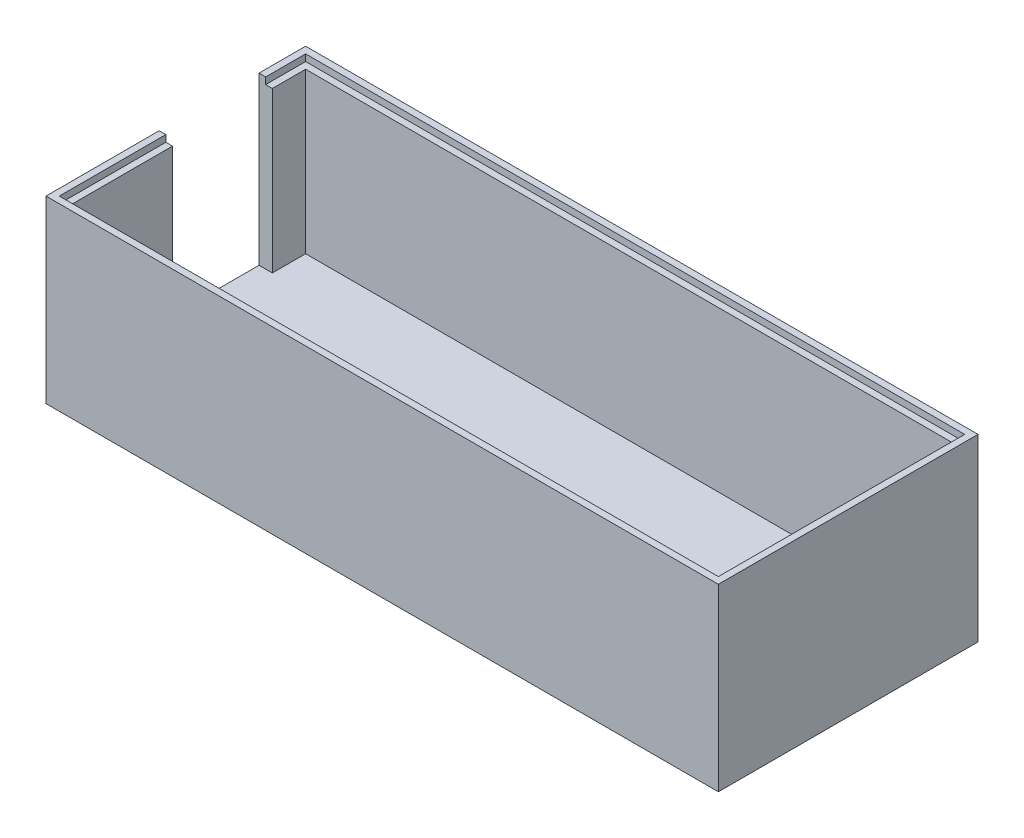
ISO-10303-21;
HEADER;
FILE_DESCRIPTION(('STEP AP214'),'2;1');
FILE_NAME('part.step','',(''),(''),'','','');
FILE_SCHEMA(('AUTOMOTIVE_DESIGN { 1 0 10303 214 1 1 1 1 }'));
ENDSEC;
DATA;
#1=APPLICATION_CONTEXT('core data for automotive mechanical design processes');
#2=APPLICATION_PROTOCOL_DEFINITION('international standard','automotive_design',2000,#1);
#3=PRODUCT_CONTEXT('',#1,'mechanical');
#4=PRODUCT('Part','Part','',(#3));
#5=PRODUCT_RELATED_PRODUCT_CATEGORY('part','',(#4));
#6=PRODUCT_DEFINITION_FORMATION('','',#4);
#7=PRODUCT_DEFINITION_CONTEXT('part definition',#1,'design');
#8=PRODUCT_DEFINITION('design','',#6,#7);
#9=PRODUCT_DEFINITION_SHAPE('','',#8);
#10=(LENGTH_UNIT() NAMED_UNIT(*) SI_UNIT(.MILLI.,.METRE.));
#11=(NAMED_UNIT(*) PLANE_ANGLE_UNIT() SI_UNIT($,.RADIAN.));
#12=(NAMED_UNIT(*) SI_UNIT($,.STERADIAN.) SOLID_ANGLE_UNIT());
#13=UNCERTAINTY_MEASURE_WITH_UNIT(LENGTH_MEASURE(1.E-05),#10,'distance_accuracy_value','');
#14=(GEOMETRIC_REPRESENTATION_CONTEXT(3) GLOBAL_UNCERTAINTY_ASSIGNED_CONTEXT((#13)) GLOBAL_UNIT_ASSIGNED_CONTEXT((#10,
#11,#12)) REPRESENTATION_CONTEXT('',''));
#15=CARTESIAN_POINT('',(0.,0.,0.));
#16=DIRECTION('',(0.,0.,1.));
#17=DIRECTION('',(1.,0.,0.));
#18=AXIS2_PLACEMENT_3D('',#15,#16,#17);
#19=CARTESIAN_POINT('',(0.,25.,0.));
#20=DIRECTION('',(0.,0.,-1.));
#21=DIRECTION('',(-1.,0.,0.));
#22=AXIS2_PLACEMENT_3D('',#19,#20,#21);
#23=PLANE('',#22);
#24=DIRECTION('',(0.,-1.,0.));
#25=VECTOR('',#24,1.);
#26=CARTESIAN_POINT('',(0.,25.,0.));
#27=LINE('',#26,#25);
#28=CARTESIAN_POINT('',(0.,25.,0.));
#29=VERTEX_POINT('',#28);
#30=CARTESIAN_POINT('',(0.,-2.,0.));
#31=VERTEX_POINT('',#30);
#32=EDGE_CURVE('E11',#29,#31,#27,.T.);
#33=ORIENTED_EDGE('',*,*,#32,.T.);
#34=DIRECTION('',(-1.,0.,0.));
#35=VECTOR('',#34,1.);
#36=CARTESIAN_POINT('',(0.,-2.,0.));
#37=LINE('',#36,#35);
#38=CARTESIAN_POINT('',(101.,-2.,0.));
#39=VERTEX_POINT('',#38);
#40=EDGE_CURVE('E155',#39,#31,#37,.T.);
#41=ORIENTED_EDGE('',*,*,#40,.F.);
#42=DIRECTION('',(0.,-1.,0.));
#43=VECTOR('',#42,1.);
#44=CARTESIAN_POINT('',(101.,25.,0.));
#45=LINE('',#44,#43);
#46=CARTESIAN_POINT('',(101.,25.,0.));
#47=VERTEX_POINT('',#46);
#48=EDGE_CURVE('E53',#47,#39,#45,.T.);
#49=ORIENTED_EDGE('',*,*,#48,.F.);
#50=DIRECTION('',(1.,0.,0.));
#51=VECTOR('',#50,1.);
#52=CARTESIAN_POINT('',(0.,25.,0.));
#53=LINE('',#52,#51);
#54=EDGE_CURVE('E234',#29,#47,#53,.T.);
#55=ORIENTED_EDGE('',*,*,#54,.F.);
#56=EDGE_LOOP('',(#33,#41,#49,#55));
#57=FACE_BOUND('',#56,.T.);
#58=ADVANCED_FACE('F45',(#57),#23,.F.);
#59=CARTESIAN_POINT('',(101.,25.,0.));
#60=DIRECTION('',(-1.,0.,0.));
#61=DIRECTION('',(0.,0.,1.));
#62=AXIS2_PLACEMENT_3D('',#59,#60,#61);
#63=PLANE('',#62);
#64=ORIENTED_EDGE('',*,*,#48,.T.);
#65=DIRECTION('',(0.,0.,1.));
#66=VECTOR('',#65,1.);
#67=CARTESIAN_POINT('',(101.,-2.,0.));
#68=LINE('',#67,#66);
#69=CARTESIAN_POINT('',(101.,-2.,-39.));
#70=VERTEX_POINT('',#69);
#71=EDGE_CURVE('E212',#70,#39,#68,.T.);
#72=ORIENTED_EDGE('',*,*,#71,.F.);
#73=DIRECTION('',(0.,-1.,0.));
#74=VECTOR('',#73,1.);
#75=CARTESIAN_POINT('',(101.,25.,-39.));
#76=LINE('',#75,#74);
#77=CARTESIAN_POINT('',(101.,25.,-39.));
#78=VERTEX_POINT('',#77);
#79=EDGE_CURVE('E133',#78,#70,#76,.T.);
#80=ORIENTED_EDGE('',*,*,#79,.F.);
#81=DIRECTION('',(0.,0.,-1.));
#82=VECTOR('',#81,1.);
#83=CARTESIAN_POINT('',(101.,25.,0.));
#84=LINE('',#83,#82);
#85=EDGE_CURVE('E116',#47,#78,#84,.T.);
#86=ORIENTED_EDGE('',*,*,#85,.F.);
#87=EDGE_LOOP('',(#64,#72,#80,#86));
#88=FACE_BOUND('',#87,.T.);
#89=ADVANCED_FACE('F210',(#88),#63,.F.);
#90=CARTESIAN_POINT('',(0.,25.,-39.));
#91=DIRECTION('',(0.,0.,1.));
#92=DIRECTION('',(1.,0.,0.));
#93=AXIS2_PLACEMENT_3D('',#90,#91,#92);
#94=PLANE('',#93);
#95=ORIENTED_EDGE('',*,*,#79,.T.);
#96=DIRECTION('',(1.,0.,0.));
#97=VECTOR('',#96,1.);
#98=CARTESIAN_POINT('',(0.,-2.,-39.));
#99=LINE('',#98,#97);
#100=CARTESIAN_POINT('',(0.,-2.,-39.));
#101=VERTEX_POINT('',#100);
#102=EDGE_CURVE('E128',#101,#70,#99,.T.);
#103=ORIENTED_EDGE('',*,*,#102,.F.);
#104=DIRECTION('',(0.,-1.,0.));
#105=VECTOR('',#104,1.);
#106=CARTESIAN_POINT('',(0.,25.,-39.));
#107=LINE('',#106,#105);
#108=CARTESIAN_POINT('',(0.,25.,-39.));
#109=VERTEX_POINT('',#108);
#110=EDGE_CURVE('E124',#109,#101,#107,.T.);
#111=ORIENTED_EDGE('',*,*,#110,.F.);
#112=DIRECTION('',(-1.,0.,0.));
#113=VECTOR('',#112,1.);
#114=CARTESIAN_POINT('',(0.,25.,-39.));
#115=LINE('',#114,#113);
#116=EDGE_CURVE('E107',#78,#109,#115,.T.);
#117=ORIENTED_EDGE('',*,*,#116,.F.);
#118=EDGE_LOOP('',(#95,#103,#111,#117));
#119=FACE_BOUND('',#118,.T.);
#120=ADVANCED_FACE('F125',(#119),#94,.F.);
#121=CARTESIAN_POINT('',(0.,25.,-39.));
#122=DIRECTION('',(1.,0.,0.));
#123=DIRECTION('',(0.,0.,-1.));
#124=AXIS2_PLACEMENT_3D('',#121,#122,#123);
#125=PLANE('',#124);
#126=ORIENTED_EDGE('',*,*,#110,.T.);
#127=DIRECTION('',(0.,0.,-1.));
#128=VECTOR('',#127,1.);
#129=CARTESIAN_POINT('',(0.,-2.,0.));
#130=LINE('',#129,#128);
#131=EDGE_CURVE('E230',#31,#101,#130,.T.);
#132=ORIENTED_EDGE('',*,*,#131,.F.);
#133=ORIENTED_EDGE('',*,*,#32,.F.);
#134=DIRECTION('',(0.,0.,1.));
#135=VECTOR('',#134,1.);
#136=CARTESIAN_POINT('',(0.,25.,-17.));
#137=LINE('',#136,#135);
#138=CARTESIAN_POINT('',(0.,25.,-17.));
#139=VERTEX_POINT('',#138);
#140=EDGE_CURVE('E177',#139,#29,#137,.T.);
#141=ORIENTED_EDGE('',*,*,#140,.F.);
#142=DIRECTION('',(0.,-1.,0.));
#143=VECTOR('',#142,1.);
#144=CARTESIAN_POINT('',(0.,25.,-17.));
#145=LINE('',#144,#143);
#146=CARTESIAN_POINT('',(0.,0.,-17.));
#147=VERTEX_POINT('',#146);
#148=EDGE_CURVE('E149',#139,#147,#145,.T.);
#149=ORIENTED_EDGE('',*,*,#148,.T.);
#150=DIRECTION('',(0.,0.,-1.));
#151=VECTOR('',#150,1.);
#152=CARTESIAN_POINT('',(0.,0.,0.));
#153=LINE('',#152,#151);
#154=CARTESIAN_POINT('',(0.,0.,-32.));
#155=VERTEX_POINT('',#154);
#156=EDGE_CURVE('E227',#147,#155,#153,.T.);
#157=ORIENTED_EDGE('',*,*,#156,.T.);
#158=DIRECTION('',(0.,-1.,0.));
#159=VECTOR('',#158,1.);
#160=CARTESIAN_POINT('',(0.,25.,-32.));
#161=LINE('',#160,#159);
#162=CARTESIAN_POINT('',(0.,25.,-32.));
#163=VERTEX_POINT('',#162);
#164=EDGE_CURVE('E134',#163,#155,#161,.T.);
#165=ORIENTED_EDGE('',*,*,#164,.F.);
#166=DIRECTION('',(0.,0.,1.));
#167=VECTOR('',#166,1.);
#168=CARTESIAN_POINT('',(0.,25.,-39.));
#169=LINE('',#168,#167);
#170=EDGE_CURVE('E113',#109,#163,#169,.T.);
#171=ORIENTED_EDGE('',*,*,#170,.F.);
#172=EDGE_LOOP('',(#126,#132,#133,#141,#149,#157,#165,#171));
#173=FACE_BOUND('',#172,.T.);
#174=ADVANCED_FACE('F136',(#173),#125,.F.);
#175=CARTESIAN_POINT('',(0.,25.,-32.));
#176=DIRECTION('',(0.,0.,-1.));
#177=DIRECTION('',(-1.,0.,0.));
#178=AXIS2_PLACEMENT_3D('',#175,#176,#177);
#179=PLANE('',#178);
#180=DIRECTION('',(1.,0.,0.));
#181=VECTOR('',#180,1.);
#182=CARTESIAN_POINT('',(2.,24.,-32.));
#183=LINE('',#182,#181);
#184=CARTESIAN_POINT('',(1.,24.,-32.));
#185=VERTEX_POINT('',#184);
#186=CARTESIAN_POINT('',(2.,24.,-32.));
#187=VERTEX_POINT('',#186);
#188=EDGE_CURVE('E247',#185,#187,#183,.T.);
#189=ORIENTED_EDGE('',*,*,#188,.F.);
#190=DIRECTION('',(0.,1.,0.));
#191=VECTOR('',#190,1.);
#192=CARTESIAN_POINT('',(1.,24.,-32.));
#193=LINE('',#192,#191);
#194=CARTESIAN_POINT('',(1.,25.,-32.));
#195=VERTEX_POINT('',#194);
#196=EDGE_CURVE('E231',#185,#195,#193,.T.);
#197=ORIENTED_EDGE('',*,*,#196,.T.);
#198=DIRECTION('',(1.,0.,0.));
#199=VECTOR('',#198,1.);
#200=CARTESIAN_POINT('',(0.,25.,-32.));
#201=LINE('',#200,#199);
#202=EDGE_CURVE('E141',#163,#195,#201,.T.);
#203=ORIENTED_EDGE('',*,*,#202,.F.);
#204=ORIENTED_EDGE('',*,*,#164,.T.);
#205=DIRECTION('',(1.,0.,0.));
#206=VECTOR('',#205,1.);
#207=CARTESIAN_POINT('',(0.,0.,-32.));
#208=LINE('',#207,#206);
#209=CARTESIAN_POINT('',(2.,0.,-32.));
#210=VERTEX_POINT('',#209);
#211=EDGE_CURVE('E150',#155,#210,#208,.T.);
#212=ORIENTED_EDGE('',*,*,#211,.T.);
#213=DIRECTION('',(0.,-1.,0.));
#214=VECTOR('',#213,1.);
#215=CARTESIAN_POINT('',(2.,25.,-32.));
#216=LINE('',#215,#214);
#217=EDGE_CURVE('E82',#187,#210,#216,.T.);
#218=ORIENTED_EDGE('',*,*,#217,.F.);
#219=EDGE_LOOP('',(#189,#197,#203,#204,#212,#218));
#220=FACE_BOUND('',#219,.T.);
#221=ADVANCED_FACE('F357',(#220),#179,.F.);
#222=CARTESIAN_POINT('',(2.,25.,-32.));
#223=DIRECTION('',(-1.,0.,0.));
#224=DIRECTION('',(0.,0.,1.));
#225=AXIS2_PLACEMENT_3D('',#222,#223,#224);
#226=PLANE('',#225);
#227=DIRECTION('',(0.,-1.,0.));
#228=VECTOR('',#227,1.);
#229=CARTESIAN_POINT('',(2.,25.,-37.));
#230=LINE('',#229,#228);
#231=CARTESIAN_POINT('',(2.,24.,-37.));
#232=VERTEX_POINT('',#231);
#233=CARTESIAN_POINT('',(2.,0.,-37.));
#234=VERTEX_POINT('',#233);
#235=EDGE_CURVE('E194',#232,#234,#230,.T.);
#236=ORIENTED_EDGE('',*,*,#235,.F.);
#237=DIRECTION('',(0.,0.,-1.));
#238=VECTOR('',#237,1.);
#239=CARTESIAN_POINT('',(2.,24.,-37.));
#240=LINE('',#239,#238);
#241=EDGE_CURVE('E270',#187,#232,#240,.T.);
#242=ORIENTED_EDGE('',*,*,#241,.F.);
#243=ORIENTED_EDGE('',*,*,#217,.T.);
#244=DIRECTION('',(0.,0.,-1.));
#245=VECTOR('',#244,1.);
#246=CARTESIAN_POINT('',(2.,0.,-32.));
#247=LINE('',#246,#245);
#248=EDGE_CURVE('E154',#210,#234,#247,.T.);
#249=ORIENTED_EDGE('',*,*,#248,.T.);
#250=EDGE_LOOP('',(#236,#242,#243,#249));
#251=FACE_BOUND('',#250,.T.);
#252=ADVANCED_FACE('F347',(#251),#226,.F.);
#253=CARTESIAN_POINT('',(2.,25.,-37.));
#254=DIRECTION('',(0.,0.,-1.));
#255=DIRECTION('',(-1.,0.,0.));
#256=AXIS2_PLACEMENT_3D('',#253,#254,#255);
#257=PLANE('',#256);
#258=DIRECTION('',(0.,-1.,0.));
#259=VECTOR('',#258,1.);
#260=CARTESIAN_POINT('',(99.,25.,-37.));
#261=LINE('',#260,#259);
#262=CARTESIAN_POINT('',(99.,24.,-37.));
#263=VERTEX_POINT('',#262);
#264=CARTESIAN_POINT('',(99.,0.,-37.));
#265=VERTEX_POINT('',#264);
#266=EDGE_CURVE('E190',#263,#265,#261,.T.);
#267=ORIENTED_EDGE('',*,*,#266,.F.);
#268=DIRECTION('',(1.,0.,0.));
#269=VECTOR('',#268,1.);
#270=CARTESIAN_POINT('',(99.,24.,-37.));
#271=LINE('',#270,#269);
#272=EDGE_CURVE('E325',#232,#263,#271,.T.);
#273=ORIENTED_EDGE('',*,*,#272,.F.);
#274=ORIENTED_EDGE('',*,*,#235,.T.);
#275=DIRECTION('',(1.,0.,0.));
#276=VECTOR('',#275,1.);
#277=CARTESIAN_POINT('',(2.,0.,-37.));
#278=LINE('',#277,#276);
#279=EDGE_CURVE('E158',#234,#265,#278,.T.);
#280=ORIENTED_EDGE('',*,*,#279,.T.);
#281=EDGE_LOOP('',(#267,#273,#274,#280));
#282=FACE_BOUND('',#281,.T.);
#283=ADVANCED_FACE('F344',(#282),#257,.F.);
#284=CARTESIAN_POINT('',(99.,25.,-37.));
#285=DIRECTION('',(1.,0.,0.));
#286=DIRECTION('',(0.,0.,-1.));
#287=AXIS2_PLACEMENT_3D('',#284,#285,#286);
#288=PLANE('',#287);
#289=DIRECTION('',(0.,-1.,0.));
#290=VECTOR('',#289,1.);
#291=CARTESIAN_POINT('',(99.,25.,-1.99999999999999));
#292=LINE('',#291,#290);
#293=CARTESIAN_POINT('',(99.,24.,-1.99999999999999));
#294=VERTEX_POINT('',#293);
#295=CARTESIAN_POINT('',(99.,0.,-1.99999999999999));
#296=VERTEX_POINT('',#295);
#297=EDGE_CURVE('E186',#294,#296,#292,.T.);
#298=ORIENTED_EDGE('',*,*,#297,.F.);
#299=DIRECTION('',(0.,0.,1.));
#300=VECTOR('',#299,1.);
#301=CARTESIAN_POINT('',(99.,24.,-1.99999999999999));
#302=LINE('',#301,#300);
#303=EDGE_CURVE('E321',#263,#294,#302,.T.);
#304=ORIENTED_EDGE('',*,*,#303,.F.);
#305=ORIENTED_EDGE('',*,*,#266,.T.);
#306=DIRECTION('',(0.,0.,1.));
#307=VECTOR('',#306,1.);
#308=CARTESIAN_POINT('',(99.,0.,-37.));
#309=LINE('',#308,#307);
#310=EDGE_CURVE('E162',#265,#296,#309,.T.);
#311=ORIENTED_EDGE('',*,*,#310,.T.);
#312=EDGE_LOOP('',(#298,#304,#305,#311));
#313=FACE_BOUND('',#312,.T.);
#314=ADVANCED_FACE('F370',(#313),#288,.F.);
#315=CARTESIAN_POINT('',(99.,25.,-1.99999999999999));
#316=DIRECTION('',(0.,0.,1.));
#317=DIRECTION('',(1.,0.,0.));
#318=AXIS2_PLACEMENT_3D('',#315,#316,#317);
#319=PLANE('',#318);
#320=DIRECTION('',(0.,-1.,0.));
#321=VECTOR('',#320,1.);
#322=CARTESIAN_POINT('',(2.,25.,-1.99999999999999));
#323=LINE('',#322,#321);
#324=CARTESIAN_POINT('',(2.,24.,-1.99999999999999));
#325=VERTEX_POINT('',#324);
#326=CARTESIAN_POINT('',(2.,0.,-1.99999999999999));
#327=VERTEX_POINT('',#326);
#328=EDGE_CURVE('E183',#325,#327,#323,.T.);
#329=ORIENTED_EDGE('',*,*,#328,.F.);
#330=DIRECTION('',(-1.,0.,0.));
#331=VECTOR('',#330,1.);
#332=CARTESIAN_POINT('',(2.,24.,-1.99999999999999));
#333=LINE('',#332,#331);
#334=EDGE_CURVE('E317',#294,#325,#333,.T.);
#335=ORIENTED_EDGE('',*,*,#334,.F.);
#336=ORIENTED_EDGE('',*,*,#297,.T.);
#337=DIRECTION('',(-1.,0.,0.));
#338=VECTOR('',#337,1.);
#339=CARTESIAN_POINT('',(99.,0.,-1.99999999999999));
#340=LINE('',#339,#338);
#341=EDGE_CURVE('E166',#296,#327,#340,.T.);
#342=ORIENTED_EDGE('',*,*,#341,.T.);
#343=EDGE_LOOP('',(#329,#335,#336,#342));
#344=FACE_BOUND('',#343,.T.);
#345=ADVANCED_FACE('F366',(#344),#319,.F.);
#346=CARTESIAN_POINT('',(2.,25.,-1.99999999999999));
#347=DIRECTION('',(-1.,0.,0.));
#348=DIRECTION('',(0.,0.,1.));
#349=AXIS2_PLACEMENT_3D('',#346,#347,#348);
#350=PLANE('',#349);
#351=DIRECTION('',(0.,-1.,0.));
#352=VECTOR('',#351,1.);
#353=CARTESIAN_POINT('',(2.,25.,-17.));
#354=LINE('',#353,#352);
#355=CARTESIAN_POINT('',(2.,24.,-17.));
#356=VERTEX_POINT('',#355);
#357=CARTESIAN_POINT('',(2.,0.,-17.));
#358=VERTEX_POINT('',#357);
#359=EDGE_CURVE('E94',#356,#358,#354,.T.);
#360=ORIENTED_EDGE('',*,*,#359,.F.);
#361=DIRECTION('',(0.,0.,-1.));
#362=VECTOR('',#361,1.);
#363=CARTESIAN_POINT('',(2.,24.,-17.));
#364=LINE('',#363,#362);
#365=EDGE_CURVE('E313',#325,#356,#364,.T.);
#366=ORIENTED_EDGE('',*,*,#365,.F.);
#367=ORIENTED_EDGE('',*,*,#328,.T.);
#368=DIRECTION('',(0.,0.,-1.));
#369=VECTOR('',#368,1.);
#370=CARTESIAN_POINT('',(2.,0.,-1.99999999999999));
#371=LINE('',#370,#369);
#372=EDGE_CURVE('E170',#327,#358,#371,.T.);
#373=ORIENTED_EDGE('',*,*,#372,.T.);
#374=EDGE_LOOP('',(#360,#366,#367,#373));
#375=FACE_BOUND('',#374,.T.);
#376=ADVANCED_FACE('F424',(#375),#350,.F.);
#377=CARTESIAN_POINT('',(2.,25.,-17.));
#378=DIRECTION('',(0.,0.,1.));
#379=DIRECTION('',(1.,0.,0.));
#380=AXIS2_PLACEMENT_3D('',#377,#378,#379);
#381=PLANE('',#380);
#382=DIRECTION('',(-1.,0.,0.));
#383=VECTOR('',#382,1.);
#384=CARTESIAN_POINT('',(2.,25.,-17.));
#385=LINE('',#384,#383);
#386=CARTESIAN_POINT('',(1.,25.,-17.));
#387=VERTEX_POINT('',#386);
#388=EDGE_CURVE('E68',#387,#139,#385,.T.);
#389=ORIENTED_EDGE('',*,*,#388,.F.);
#390=DIRECTION('',(0.,1.,0.));
#391=VECTOR('',#390,1.);
#392=CARTESIAN_POINT('',(1.,24.,-17.));
#393=LINE('',#392,#391);
#394=CARTESIAN_POINT('',(1.,24.,-17.));
#395=VERTEX_POINT('',#394);
#396=EDGE_CURVE('E60',#395,#387,#393,.T.);
#397=ORIENTED_EDGE('',*,*,#396,.F.);
#398=DIRECTION('',(-1.,0.,0.));
#399=VECTOR('',#398,1.);
#400=CARTESIAN_POINT('',(1.,24.,-17.));
#401=LINE('',#400,#399);
#402=EDGE_CURVE('E309',#356,#395,#401,.T.);
#403=ORIENTED_EDGE('',*,*,#402,.F.);
#404=ORIENTED_EDGE('',*,*,#359,.T.);
#405=DIRECTION('',(-1.,0.,0.));
#406=VECTOR('',#405,1.);
#407=CARTESIAN_POINT('',(2.,0.,-17.));
#408=LINE('',#407,#406);
#409=EDGE_CURVE('E174',#358,#147,#408,.T.);
#410=ORIENTED_EDGE('',*,*,#409,.T.);
#411=ORIENTED_EDGE('',*,*,#148,.F.);
#412=EDGE_LOOP('',(#389,#397,#403,#404,#410,#411));
#413=FACE_BOUND('',#412,.T.);
#414=ADVANCED_FACE('F422',(#413),#381,.F.);
#415=CARTESIAN_POINT('',(0.,25.,0.));
#416=DIRECTION('',(0.,1.,0.));
#417=DIRECTION('',(0.,0.,1.));
#418=AXIS2_PLACEMENT_3D('',#415,#416,#417);
#419=PLANE('',#418);
#420=DIRECTION('',(0.,0.,1.));
#421=VECTOR('',#420,1.);
#422=CARTESIAN_POINT('',(1.,25.,-32.));
#423=LINE('',#422,#421);
#424=CARTESIAN_POINT('',(1.,25.,-38.));
#425=VERTEX_POINT('',#424);
#426=EDGE_CURVE('E266',#425,#195,#423,.T.);
#427=ORIENTED_EDGE('',*,*,#426,.F.);
#428=DIRECTION('',(-1.,0.,0.));
#429=VECTOR('',#428,1.);
#430=CARTESIAN_POINT('',(1.,25.,-38.));
#431=LINE('',#430,#429);
#432=CARTESIAN_POINT('',(100.,25.,-38.));
#433=VERTEX_POINT('',#432);
#434=EDGE_CURVE('E271',#433,#425,#431,.T.);
#435=ORIENTED_EDGE('',*,*,#434,.F.);
#436=DIRECTION('',(0.,0.,-1.));
#437=VECTOR('',#436,1.);
#438=CARTESIAN_POINT('',(100.,25.,-38.));
#439=LINE('',#438,#437);
#440=CARTESIAN_POINT('',(100.,25.,-1.));
#441=VERTEX_POINT('',#440);
#442=EDGE_CURVE('E275',#441,#433,#439,.T.);
#443=ORIENTED_EDGE('',*,*,#442,.F.);
#444=DIRECTION('',(1.,0.,0.));
#445=VECTOR('',#444,1.);
#446=CARTESIAN_POINT('',(100.,25.,-1.));
#447=LINE('',#446,#445);
#448=CARTESIAN_POINT('',(1.,25.,-1.));
#449=VERTEX_POINT('',#448);
#450=EDGE_CURVE('E279',#449,#441,#447,.T.);
#451=ORIENTED_EDGE('',*,*,#450,.F.);
#452=DIRECTION('',(0.,0.,1.));
#453=VECTOR('',#452,1.);
#454=CARTESIAN_POINT('',(1.,25.,-1.));
#455=LINE('',#454,#453);
#456=EDGE_CURVE('E283',#387,#449,#455,.T.);
#457=ORIENTED_EDGE('',*,*,#456,.F.);
#458=ORIENTED_EDGE('',*,*,#388,.T.);
#459=ORIENTED_EDGE('',*,*,#140,.T.);
#460=ORIENTED_EDGE('',*,*,#54,.T.);
#461=ORIENTED_EDGE('',*,*,#85,.T.);
#462=ORIENTED_EDGE('',*,*,#116,.T.);
#463=ORIENTED_EDGE('',*,*,#170,.T.);
#464=ORIENTED_EDGE('',*,*,#202,.T.);
#465=EDGE_LOOP('',(#427,#435,#443,#451,#457,#458,#459,#460,#461,#462,#463,#464));
#466=FACE_BOUND('',#465,.T.);
#467=ADVANCED_FACE('F110',(#466),#419,.T.);
#468=CARTESIAN_POINT('',(0.,-2.,0.));
#469=DIRECTION('',(0.,-1.,0.));
#470=DIRECTION('',(0.,0.,-1.));
#471=AXIS2_PLACEMENT_3D('',#468,#469,#470);
#472=PLANE('',#471);
#473=ORIENTED_EDGE('',*,*,#131,.T.);
#474=ORIENTED_EDGE('',*,*,#102,.T.);
#475=ORIENTED_EDGE('',*,*,#71,.T.);
#476=ORIENTED_EDGE('',*,*,#40,.T.);
#477=EDGE_LOOP('',(#473,#474,#475,#476));
#478=FACE_BOUND('',#477,.T.);
#479=ADVANCED_FACE('F219',(#478),#472,.T.);
#480=CARTESIAN_POINT('',(0.,0.,0.));
#481=DIRECTION('',(0.,-1.,0.));
#482=DIRECTION('',(0.,0.,-1.));
#483=AXIS2_PLACEMENT_3D('',#480,#481,#482);
#484=PLANE('',#483);
#485=ORIENTED_EDGE('',*,*,#409,.F.);
#486=ORIENTED_EDGE('',*,*,#372,.F.);
#487=ORIENTED_EDGE('',*,*,#341,.F.);
#488=ORIENTED_EDGE('',*,*,#310,.F.);
#489=ORIENTED_EDGE('',*,*,#279,.F.);
#490=ORIENTED_EDGE('',*,*,#248,.F.);
#491=ORIENTED_EDGE('',*,*,#211,.F.);
#492=ORIENTED_EDGE('',*,*,#156,.F.);
#493=EDGE_LOOP('',(#485,#486,#487,#488,#489,#490,#491,#492));
#494=FACE_BOUND('',#493,.T.);
#495=ADVANCED_FACE('F353',(#494),#484,.F.);
#496=CARTESIAN_POINT('',(1.,24.,-32.));
#497=DIRECTION('',(-1.,0.,0.));
#498=DIRECTION('',(0.,0.,1.));
#499=AXIS2_PLACEMENT_3D('',#496,#497,#498);
#500=PLANE('',#499);
#501=ORIENTED_EDGE('',*,*,#426,.T.);
#502=ORIENTED_EDGE('',*,*,#196,.F.);
#503=DIRECTION('',(0.,0.,1.));
#504=VECTOR('',#503,1.);
#505=CARTESIAN_POINT('',(1.,24.,-32.));
#506=LINE('',#505,#504);
#507=CARTESIAN_POINT('',(1.,24.,-38.));
#508=VERTEX_POINT('',#507);
#509=EDGE_CURVE('E289',#508,#185,#506,.T.);
#510=ORIENTED_EDGE('',*,*,#509,.F.);
#511=DIRECTION('',(0.,1.,0.));
#512=VECTOR('',#511,1.);
#513=CARTESIAN_POINT('',(1.,24.,-38.));
#514=LINE('',#513,#512);
#515=EDGE_CURVE('E259',#508,#425,#514,.T.);
#516=ORIENTED_EDGE('',*,*,#515,.T.);
#517=EDGE_LOOP('',(#501,#502,#510,#516));
#518=FACE_BOUND('',#517,.T.);
#519=ADVANCED_FACE('F408',(#518),#500,.F.);
#520=CARTESIAN_POINT('',(1.,24.,-38.));
#521=DIRECTION('',(0.,0.,-1.));
#522=DIRECTION('',(-1.,0.,0.));
#523=AXIS2_PLACEMENT_3D('',#520,#521,#522);
#524=PLANE('',#523);
#525=ORIENTED_EDGE('',*,*,#434,.T.);
#526=ORIENTED_EDGE('',*,*,#515,.F.);
#527=DIRECTION('',(-1.,0.,0.));
#528=VECTOR('',#527,1.);
#529=CARTESIAN_POINT('',(1.,24.,-38.));
#530=LINE('',#529,#528);
#531=CARTESIAN_POINT('',(100.,24.,-38.));
#532=VERTEX_POINT('',#531);
#533=EDGE_CURVE('E293',#532,#508,#530,.T.);
#534=ORIENTED_EDGE('',*,*,#533,.F.);
#535=DIRECTION('',(0.,1.,0.));
#536=VECTOR('',#535,1.);
#537=CARTESIAN_POINT('',(100.,24.,-38.));
#538=LINE('',#537,#536);
#539=EDGE_CURVE('E255',#532,#433,#538,.T.);
#540=ORIENTED_EDGE('',*,*,#539,.T.);
#541=EDGE_LOOP('',(#525,#526,#534,#540));
#542=FACE_BOUND('',#541,.T.);
#543=ADVANCED_FACE('F414',(#542),#524,.F.);
#544=CARTESIAN_POINT('',(100.,24.,-38.));
#545=DIRECTION('',(1.,0.,0.));
#546=DIRECTION('',(0.,0.,-1.));
#547=AXIS2_PLACEMENT_3D('',#544,#545,#546);
#548=PLANE('',#547);
#549=ORIENTED_EDGE('',*,*,#442,.T.);
#550=ORIENTED_EDGE('',*,*,#539,.F.);
#551=DIRECTION('',(0.,0.,-1.));
#552=VECTOR('',#551,1.);
#553=CARTESIAN_POINT('',(100.,24.,-38.));
#554=LINE('',#553,#552);
#555=CARTESIAN_POINT('',(100.,24.,-1.));
#556=VERTEX_POINT('',#555);
#557=EDGE_CURVE('E297',#556,#532,#554,.T.);
#558=ORIENTED_EDGE('',*,*,#557,.F.);
#559=DIRECTION('',(0.,1.,0.));
#560=VECTOR('',#559,1.);
#561=CARTESIAN_POINT('',(100.,24.,-1.));
#562=LINE('',#561,#560);
#563=EDGE_CURVE('E251',#556,#441,#562,.T.);
#564=ORIENTED_EDGE('',*,*,#563,.T.);
#565=EDGE_LOOP('',(#549,#550,#558,#564));
#566=FACE_BOUND('',#565,.T.);
#567=ADVANCED_FACE('F418',(#566),#548,.F.);
#568=CARTESIAN_POINT('',(100.,24.,-1.));
#569=DIRECTION('',(0.,0.,1.));
#570=DIRECTION('',(1.,0.,0.));
#571=AXIS2_PLACEMENT_3D('',#568,#569,#570);
#572=PLANE('',#571);
#573=ORIENTED_EDGE('',*,*,#450,.T.);
#574=ORIENTED_EDGE('',*,*,#563,.F.);
#575=DIRECTION('',(1.,0.,0.));
#576=VECTOR('',#575,1.);
#577=CARTESIAN_POINT('',(100.,24.,-1.));
#578=LINE('',#577,#576);
#579=CARTESIAN_POINT('',(1.,24.,-1.));
#580=VERTEX_POINT('',#579);
#581=EDGE_CURVE('E301',#580,#556,#578,.T.);
#582=ORIENTED_EDGE('',*,*,#581,.F.);
#583=DIRECTION('',(0.,1.,0.));
#584=VECTOR('',#583,1.);
#585=CARTESIAN_POINT('',(1.,24.,-1.));
#586=LINE('',#585,#584);
#587=EDGE_CURVE('E246',#580,#449,#586,.T.);
#588=ORIENTED_EDGE('',*,*,#587,.T.);
#589=EDGE_LOOP('',(#573,#574,#582,#588));
#590=FACE_BOUND('',#589,.T.);
#591=ADVANCED_FACE('F421',(#590),#572,.F.);
#592=CARTESIAN_POINT('',(1.,24.,-1.));
#593=DIRECTION('',(-1.,0.,0.));
#594=DIRECTION('',(0.,0.,1.));
#595=AXIS2_PLACEMENT_3D('',#592,#593,#594);
#596=PLANE('',#595);
#597=ORIENTED_EDGE('',*,*,#456,.T.);
#598=ORIENTED_EDGE('',*,*,#587,.F.);
#599=DIRECTION('',(0.,0.,1.));
#600=VECTOR('',#599,1.);
#601=CARTESIAN_POINT('',(1.,24.,-1.));
#602=LINE('',#601,#600);
#603=EDGE_CURVE('E305',#395,#580,#602,.T.);
#604=ORIENTED_EDGE('',*,*,#603,.F.);
#605=ORIENTED_EDGE('',*,*,#396,.T.);
#606=EDGE_LOOP('',(#597,#598,#604,#605));
#607=FACE_BOUND('',#606,.T.);
#608=ADVANCED_FACE('F425',(#607),#596,.F.);
#609=CARTESIAN_POINT('',(0.,24.,0.));
#610=DIRECTION('',(0.,-1.,0.));
#611=DIRECTION('',(0.,0.,-1.));
#612=AXIS2_PLACEMENT_3D('',#609,#610,#611);
#613=PLANE('',#612);
#614=ORIENTED_EDGE('',*,*,#241,.T.);
#615=ORIENTED_EDGE('',*,*,#272,.T.);
#616=ORIENTED_EDGE('',*,*,#303,.T.);
#617=ORIENTED_EDGE('',*,*,#334,.T.);
#618=ORIENTED_EDGE('',*,*,#365,.T.);
#619=ORIENTED_EDGE('',*,*,#402,.T.);
#620=ORIENTED_EDGE('',*,*,#603,.T.);
#621=ORIENTED_EDGE('',*,*,#581,.T.);
#622=ORIENTED_EDGE('',*,*,#557,.T.);
#623=ORIENTED_EDGE('',*,*,#533,.T.);
#624=ORIENTED_EDGE('',*,*,#509,.T.);
#625=ORIENTED_EDGE('',*,*,#188,.T.);
#626=EDGE_LOOP('',(#614,#615,#616,#617,#618,#619,#620,#621,#622,#623,#624,#625));
#627=FACE_BOUND('',#626,.T.);
#628=ADVANCED_FACE('F334',(#627),#613,.F.);
#629=CLOSED_SHELL('',(#58,#89,#120,#174,#221,#252,#283,#314,#345,#376,#414,#467,#479,#495,#519,
#543,#567,#591,#608,#628));
#630=MANIFOLD_SOLID_BREP('B2',#629);
#631=ADVANCED_BREP_SHAPE_REPRESENTATION('',(#18,#630),#14);
#632=SHAPE_DEFINITION_REPRESENTATION(#9,#631);
ENDSEC;
END-ISO-10303-21;
